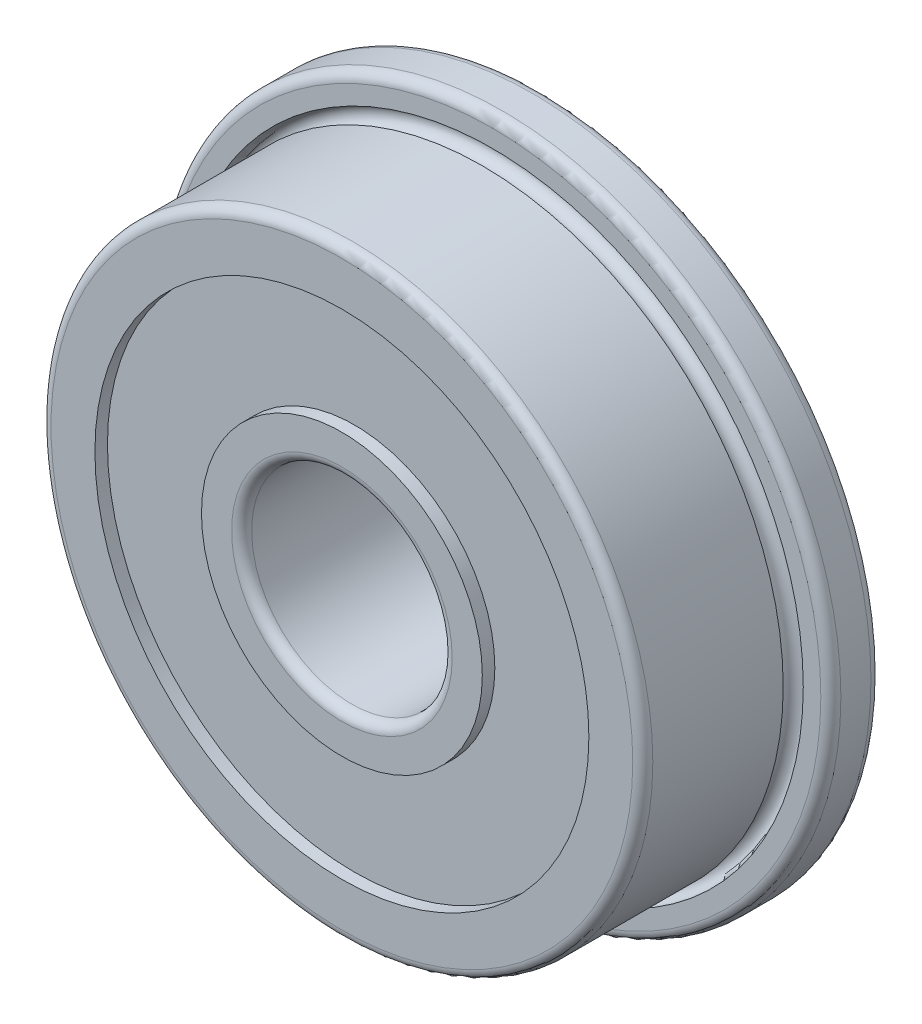
ISO-10303-21;
HEADER;
FILE_DESCRIPTION(('STEP AP214'),'2;1');
FILE_NAME('part.step','',(''),(''),'','','');
FILE_SCHEMA(('AUTOMOTIVE_DESIGN { 1 0 10303 214 1 1 1 1 }'));
ENDSEC;
DATA;
#1=APPLICATION_CONTEXT('core data for automotive mechanical design processes');
#2=APPLICATION_PROTOCOL_DEFINITION('international standard','automotive_design',2000,#1);
#3=PRODUCT_CONTEXT('',#1,'mechanical');
#4=PRODUCT('Part','Part','',(#3));
#5=PRODUCT_RELATED_PRODUCT_CATEGORY('part','',(#4));
#6=PRODUCT_DEFINITION_FORMATION('','',#4);
#7=PRODUCT_DEFINITION_CONTEXT('part definition',#1,'design');
#8=PRODUCT_DEFINITION('design','',#6,#7);
#9=PRODUCT_DEFINITION_SHAPE('','',#8);
#10=(LENGTH_UNIT() NAMED_UNIT(*) SI_UNIT(.MILLI.,.METRE.));
#11=(NAMED_UNIT(*) PLANE_ANGLE_UNIT() SI_UNIT($,.RADIAN.));
#12=(NAMED_UNIT(*) SI_UNIT($,.STERADIAN.) SOLID_ANGLE_UNIT());
#13=UNCERTAINTY_MEASURE_WITH_UNIT(LENGTH_MEASURE(1.E-05),#10,'distance_accuracy_value','');
#14=(GEOMETRIC_REPRESENTATION_CONTEXT(3) GLOBAL_UNCERTAINTY_ASSIGNED_CONTEXT((#13)) GLOBAL_UNIT_ASSIGNED_CONTEXT((#10,
#11,#12)) REPRESENTATION_CONTEXT('',''));
#15=CARTESIAN_POINT('',(0.,0.,0.));
#16=DIRECTION('',(0.,0.,1.));
#17=DIRECTION('',(1.,0.,0.));
#18=AXIS2_PLACEMENT_3D('',#15,#16,#17);
#19=CARTESIAN_POINT('',(0.,0.,-0.200000000000018));
#20=DIRECTION('',(0.,0.,1.));
#21=DIRECTION('',(1.,0.,0.));
#22=AXIS2_PLACEMENT_3D('',#19,#20,#21);
#23=TOROIDAL_SURFACE('',#22,5.79999999999998,0.200000000000018);
#24=CARTESIAN_POINT('',(0.,0.,0.));
#25=DIRECTION('',(0.,0.,1.));
#26=DIRECTION('',(1.,0.,0.));
#27=AXIS2_PLACEMENT_3D('',#24,#25,#26);
#28=CIRCLE('',#27,5.8);
#29=CARTESIAN_POINT('',(5.8,0.,0.));
#30=VERTEX_POINT('',#29);
#31=EDGE_CURVE('E10',#30,#30,#28,.T.);
#32=ORIENTED_EDGE('',*,*,#31,.F.);
#33=EDGE_LOOP('',(#32));
#34=FACE_BOUND('',#33,.T.);
#35=CARTESIAN_POINT('',(0.,0.,-0.2));
#36=DIRECTION('',(0.,0.,1.));
#37=DIRECTION('',(1.,0.,0.));
#38=AXIS2_PLACEMENT_3D('',#35,#36,#37);
#39=CIRCLE('',#38,6.);
#40=CARTESIAN_POINT('',(6.,0.,-0.2));
#41=VERTEX_POINT('',#40);
#42=EDGE_CURVE('E99',#41,#41,#39,.T.);
#43=ORIENTED_EDGE('',*,*,#42,.T.);
#44=EDGE_LOOP('',(#43));
#45=FACE_BOUND('',#44,.T.);
#46=ADVANCED_FACE('F35',(#34,#45),#23,.T.);
#47=CARTESIAN_POINT('',(0.,5.8,0.));
#48=DIRECTION('',(0.,0.,-1.));
#49=DIRECTION('',(-1.,0.,0.));
#50=AXIS2_PLACEMENT_3D('',#47,#48,#49);
#51=PLANE('',#50);
#52=CARTESIAN_POINT('',(0.,0.,0.));
#53=DIRECTION('',(0.,0.,1.));
#54=DIRECTION('',(1.,0.,0.));
#55=AXIS2_PLACEMENT_3D('',#52,#53,#54);
#56=CIRCLE('',#55,4.925);
#57=CARTESIAN_POINT('',(4.925,0.,0.));
#58=VERTEX_POINT('',#57);
#59=EDGE_CURVE('E41',#58,#58,#56,.T.);
#60=ORIENTED_EDGE('',*,*,#59,.F.);
#61=EDGE_LOOP('',(#60));
#62=FACE_BOUND('',#61,.T.);
#63=ORIENTED_EDGE('',*,*,#31,.T.);
#64=EDGE_LOOP('',(#63));
#65=FACE_BOUND('',#64,.T.);
#66=ADVANCED_FACE('F208',(#62,#65),#51,.F.);
#67=CARTESIAN_POINT('',(0.,0.,-4.));
#68=DIRECTION('',(0.,0.,1.));
#69=DIRECTION('',(1.,0.,0.));
#70=AXIS2_PLACEMENT_3D('',#67,#68,#69);
#71=CYLINDRICAL_SURFACE('',#70,4.925);
#72=CARTESIAN_POINT('',(0.,0.,-0.25));
#73=DIRECTION('',(0.,0.,1.));
#74=DIRECTION('',(1.,0.,0.));
#75=AXIS2_PLACEMENT_3D('',#72,#73,#74);
#76=CIRCLE('',#75,4.925);
#77=CARTESIAN_POINT('',(4.925,0.,-0.25));
#78=VERTEX_POINT('',#77);
#79=EDGE_CURVE('E45',#78,#78,#76,.T.);
#80=ORIENTED_EDGE('',*,*,#79,.F.);
#81=EDGE_LOOP('',(#80));
#82=FACE_BOUND('',#81,.T.);
#83=ORIENTED_EDGE('',*,*,#59,.T.);
#84=EDGE_LOOP('',(#83));
#85=FACE_BOUND('',#84,.T.);
#86=ADVANCED_FACE('F203',(#82,#85),#71,.F.);
#87=CARTESIAN_POINT('',(0.,4.925,-0.25));
#88=DIRECTION('',(0.,0.,-1.));
#89=DIRECTION('',(-1.,0.,0.));
#90=AXIS2_PLACEMENT_3D('',#87,#88,#89);
#91=PLANE('',#90);
#92=CARTESIAN_POINT('',(0.,0.,-0.25));
#93=DIRECTION('',(0.,0.,1.));
#94=DIRECTION('',(1.,0.,0.));
#95=AXIS2_PLACEMENT_3D('',#92,#93,#94);
#96=CIRCLE('',#95,2.8);
#97=CARTESIAN_POINT('',(2.8,0.,-0.25));
#98=VERTEX_POINT('',#97);
#99=EDGE_CURVE('E49',#98,#98,#96,.T.);
#100=ORIENTED_EDGE('',*,*,#99,.F.);
#101=EDGE_LOOP('',(#100));
#102=FACE_BOUND('',#101,.T.);
#103=ORIENTED_EDGE('',*,*,#79,.T.);
#104=EDGE_LOOP('',(#103));
#105=FACE_BOUND('',#104,.T.);
#106=ADVANCED_FACE('F197',(#102,#105),#91,.F.);
#107=CARTESIAN_POINT('',(0.,0.,-4.));
#108=DIRECTION('',(0.,0.,1.));
#109=DIRECTION('',(1.,0.,0.));
#110=AXIS2_PLACEMENT_3D('',#107,#108,#109);
#111=CYLINDRICAL_SURFACE('',#110,2.8);
#112=CARTESIAN_POINT('',(0.,0.,0.));
#113=DIRECTION('',(0.,0.,1.));
#114=DIRECTION('',(1.,0.,0.));
#115=AXIS2_PLACEMENT_3D('',#112,#113,#114);
#116=CIRCLE('',#115,2.8);
#117=CARTESIAN_POINT('',(2.8,0.,0.));
#118=VERTEX_POINT('',#117);
#119=EDGE_CURVE('E54',#118,#118,#116,.T.);
#120=ORIENTED_EDGE('',*,*,#119,.F.);
#121=EDGE_LOOP('',(#120));
#122=FACE_BOUND('',#121,.T.);
#123=ORIENTED_EDGE('',*,*,#99,.T.);
#124=EDGE_LOOP('',(#123));
#125=FACE_BOUND('',#124,.T.);
#126=ADVANCED_FACE('F191',(#122,#125),#111,.T.);
#127=CARTESIAN_POINT('',(0.,2.8,0.));
#128=DIRECTION('',(0.,0.,-1.));
#129=DIRECTION('',(-1.,0.,0.));
#130=AXIS2_PLACEMENT_3D('',#127,#128,#129);
#131=PLANE('',#130);
#132=CARTESIAN_POINT('',(0.,0.,0.));
#133=DIRECTION('',(0.,0.,1.));
#134=DIRECTION('',(1.,0.,0.));
#135=AXIS2_PLACEMENT_3D('',#132,#133,#134);
#136=CIRCLE('',#135,2.2);
#137=CARTESIAN_POINT('',(2.2,0.,0.));
#138=VERTEX_POINT('',#137);
#139=EDGE_CURVE('E57',#138,#138,#136,.T.);
#140=ORIENTED_EDGE('',*,*,#139,.F.);
#141=EDGE_LOOP('',(#140));
#142=FACE_BOUND('',#141,.T.);
#143=ORIENTED_EDGE('',*,*,#119,.T.);
#144=EDGE_LOOP('',(#143));
#145=FACE_BOUND('',#144,.T.);
#146=ADVANCED_FACE('F185',(#142,#145),#131,.F.);
#147=CARTESIAN_POINT('',(0.,0.,-0.200000000000015));
#148=DIRECTION('',(0.,0.,1.));
#149=DIRECTION('',(1.,0.,0.));
#150=AXIS2_PLACEMENT_3D('',#147,#148,#149);
#151=TOROIDAL_SURFACE('',#150,2.20000000000002,0.200000000000015);
#152=CARTESIAN_POINT('',(0.,0.,-0.2));
#153=DIRECTION('',(0.,0.,1.));
#154=DIRECTION('',(1.,0.,0.));
#155=AXIS2_PLACEMENT_3D('',#152,#153,#154);
#156=CIRCLE('',#155,2.);
#157=CARTESIAN_POINT('',(2.,0.,-0.2));
#158=VERTEX_POINT('',#157);
#159=EDGE_CURVE('E60',#158,#158,#156,.T.);
#160=ORIENTED_EDGE('',*,*,#159,.F.);
#161=EDGE_LOOP('',(#160));
#162=FACE_BOUND('',#161,.T.);
#163=ORIENTED_EDGE('',*,*,#139,.T.);
#164=EDGE_LOOP('',(#163));
#165=FACE_BOUND('',#164,.T.);
#166=ADVANCED_FACE('F179',(#162,#165),#151,.T.);
#167=CARTESIAN_POINT('',(0.,0.,-4.));
#168=DIRECTION('',(0.,0.,1.));
#169=DIRECTION('',(1.,0.,0.));
#170=AXIS2_PLACEMENT_3D('',#167,#168,#169);
#171=CYLINDRICAL_SURFACE('',#170,2.);
#172=CARTESIAN_POINT('',(0.,0.,-3.8));
#173=DIRECTION('',(0.,0.,1.));
#174=DIRECTION('',(1.,0.,0.));
#175=AXIS2_PLACEMENT_3D('',#172,#173,#174);
#176=CIRCLE('',#175,2.);
#177=CARTESIAN_POINT('',(2.,0.,-3.8));
#178=VERTEX_POINT('',#177);
#179=EDGE_CURVE('E63',#178,#178,#176,.T.);
#180=ORIENTED_EDGE('',*,*,#179,.F.);
#181=EDGE_LOOP('',(#180));
#182=FACE_BOUND('',#181,.T.);
#183=ORIENTED_EDGE('',*,*,#159,.T.);
#184=EDGE_LOOP('',(#183));
#185=FACE_BOUND('',#184,.T.);
#186=ADVANCED_FACE('F173',(#182,#185),#171,.F.);
#187=CARTESIAN_POINT('',(0.,0.,-3.79999999999997));
#188=DIRECTION('',(0.,0.,1.));
#189=DIRECTION('',(1.,0.,0.));
#190=AXIS2_PLACEMENT_3D('',#187,#188,#189);
#191=TOROIDAL_SURFACE('',#190,2.20000000000003,0.200000000000033);
#192=CARTESIAN_POINT('',(0.,0.,-4.));
#193=DIRECTION('',(0.,0.,1.));
#194=DIRECTION('',(1.,0.,0.));
#195=AXIS2_PLACEMENT_3D('',#192,#193,#194);
#196=CIRCLE('',#195,2.2);
#197=CARTESIAN_POINT('',(2.2,0.,-4.));
#198=VERTEX_POINT('',#197);
#199=EDGE_CURVE('E66',#198,#198,#196,.T.);
#200=ORIENTED_EDGE('',*,*,#199,.F.);
#201=EDGE_LOOP('',(#200));
#202=FACE_BOUND('',#201,.T.);
#203=ORIENTED_EDGE('',*,*,#179,.T.);
#204=EDGE_LOOP('',(#203));
#205=FACE_BOUND('',#204,.T.);
#206=ADVANCED_FACE('F167',(#202,#205),#191,.T.);
#207=CARTESIAN_POINT('',(0.,2.2,-4.));
#208=DIRECTION('',(0.,0.,1.));
#209=DIRECTION('',(1.,0.,0.));
#210=AXIS2_PLACEMENT_3D('',#207,#208,#209);
#211=PLANE('',#210);
#212=CARTESIAN_POINT('',(0.,0.,-4.));
#213=DIRECTION('',(0.,0.,1.));
#214=DIRECTION('',(1.,0.,0.));
#215=AXIS2_PLACEMENT_3D('',#212,#213,#214);
#216=CIRCLE('',#215,2.8);
#217=CARTESIAN_POINT('',(2.8,0.,-4.));
#218=VERTEX_POINT('',#217);
#219=EDGE_CURVE('E69',#218,#218,#216,.T.);
#220=ORIENTED_EDGE('',*,*,#219,.F.);
#221=EDGE_LOOP('',(#220));
#222=FACE_BOUND('',#221,.T.);
#223=ORIENTED_EDGE('',*,*,#199,.T.);
#224=EDGE_LOOP('',(#223));
#225=FACE_BOUND('',#224,.T.);
#226=ADVANCED_FACE('F161',(#222,#225),#211,.F.);
#227=CARTESIAN_POINT('',(0.,0.,-4.));
#228=DIRECTION('',(0.,0.,1.));
#229=DIRECTION('',(1.,0.,0.));
#230=AXIS2_PLACEMENT_3D('',#227,#228,#229);
#231=CYLINDRICAL_SURFACE('',#230,2.8);
#232=CARTESIAN_POINT('',(0.,0.,-3.75));
#233=DIRECTION('',(0.,0.,1.));
#234=DIRECTION('',(1.,0.,0.));
#235=AXIS2_PLACEMENT_3D('',#232,#233,#234);
#236=CIRCLE('',#235,2.8);
#237=CARTESIAN_POINT('',(2.8,0.,-3.75));
#238=VERTEX_POINT('',#237);
#239=EDGE_CURVE('E72',#238,#238,#236,.T.);
#240=ORIENTED_EDGE('',*,*,#239,.F.);
#241=EDGE_LOOP('',(#240));
#242=FACE_BOUND('',#241,.T.);
#243=ORIENTED_EDGE('',*,*,#219,.T.);
#244=EDGE_LOOP('',(#243));
#245=FACE_BOUND('',#244,.T.);
#246=ADVANCED_FACE('F155',(#242,#245),#231,.T.);
#247=CARTESIAN_POINT('',(0.,2.8,-3.75));
#248=DIRECTION('',(0.,0.,1.));
#249=DIRECTION('',(1.,0.,0.));
#250=AXIS2_PLACEMENT_3D('',#247,#248,#249);
#251=PLANE('',#250);
#252=CARTESIAN_POINT('',(0.,0.,-3.75));
#253=DIRECTION('',(0.,0.,1.));
#254=DIRECTION('',(1.,0.,0.));
#255=AXIS2_PLACEMENT_3D('',#252,#253,#254);
#256=CIRCLE('',#255,4.925);
#257=CARTESIAN_POINT('',(4.925,0.,-3.75));
#258=VERTEX_POINT('',#257);
#259=EDGE_CURVE('E75',#258,#258,#256,.T.);
#260=ORIENTED_EDGE('',*,*,#259,.F.);
#261=EDGE_LOOP('',(#260));
#262=FACE_BOUND('',#261,.T.);
#263=ORIENTED_EDGE('',*,*,#239,.T.);
#264=EDGE_LOOP('',(#263));
#265=FACE_BOUND('',#264,.T.);
#266=ADVANCED_FACE('F149',(#262,#265),#251,.F.);
#267=CARTESIAN_POINT('',(0.,0.,-4.));
#268=DIRECTION('',(0.,0.,1.));
#269=DIRECTION('',(1.,0.,0.));
#270=AXIS2_PLACEMENT_3D('',#267,#268,#269);
#271=CYLINDRICAL_SURFACE('',#270,4.925);
#272=CARTESIAN_POINT('',(0.,0.,-4.));
#273=DIRECTION('',(0.,0.,1.));
#274=DIRECTION('',(1.,0.,0.));
#275=AXIS2_PLACEMENT_3D('',#272,#273,#274);
#276=CIRCLE('',#275,4.925);
#277=CARTESIAN_POINT('',(4.925,0.,-4.));
#278=VERTEX_POINT('',#277);
#279=EDGE_CURVE('E78',#278,#278,#276,.T.);
#280=ORIENTED_EDGE('',*,*,#279,.F.);
#281=EDGE_LOOP('',(#280));
#282=FACE_BOUND('',#281,.T.);
#283=ORIENTED_EDGE('',*,*,#259,.T.);
#284=EDGE_LOOP('',(#283));
#285=FACE_BOUND('',#284,.T.);
#286=ADVANCED_FACE('F143',(#282,#285),#271,.F.);
#287=CARTESIAN_POINT('',(0.,4.925,-4.));
#288=DIRECTION('',(0.,0.,1.));
#289=DIRECTION('',(1.,0.,0.));
#290=AXIS2_PLACEMENT_3D('',#287,#288,#289);
#291=PLANE('',#290);
#292=CARTESIAN_POINT('',(0.,0.,-4.));
#293=DIRECTION('',(0.,0.,1.));
#294=DIRECTION('',(1.,0.,0.));
#295=AXIS2_PLACEMENT_3D('',#292,#293,#294);
#296=CIRCLE('',#295,6.55);
#297=CARTESIAN_POINT('',(6.55,0.,-4.));
#298=VERTEX_POINT('',#297);
#299=EDGE_CURVE('E81',#298,#298,#296,.T.);
#300=ORIENTED_EDGE('',*,*,#299,.F.);
#301=EDGE_LOOP('',(#300));
#302=FACE_BOUND('',#301,.T.);
#303=ORIENTED_EDGE('',*,*,#279,.T.);
#304=EDGE_LOOP('',(#303));
#305=FACE_BOUND('',#304,.T.);
#306=ADVANCED_FACE('F137',(#302,#305),#291,.F.);
#307=CARTESIAN_POINT('',(0.,0.,-3.79999999999997));
#308=DIRECTION('',(0.,0.,1.));
#309=DIRECTION('',(1.,0.,0.));
#310=AXIS2_PLACEMENT_3D('',#307,#308,#309);
#311=TOROIDAL_SURFACE('',#310,6.54999999999997,0.200000000000032);
#312=CARTESIAN_POINT('',(0.,0.,-3.8));
#313=DIRECTION('',(0.,0.,1.));
#314=DIRECTION('',(1.,0.,0.));
#315=AXIS2_PLACEMENT_3D('',#312,#313,#314);
#316=CIRCLE('',#315,6.75);
#317=CARTESIAN_POINT('',(6.75,0.,-3.8));
#318=VERTEX_POINT('',#317);
#319=EDGE_CURVE('E84',#318,#318,#316,.T.);
#320=ORIENTED_EDGE('',*,*,#319,.F.);
#321=EDGE_LOOP('',(#320));
#322=FACE_BOUND('',#321,.T.);
#323=ORIENTED_EDGE('',*,*,#299,.T.);
#324=EDGE_LOOP('',(#323));
#325=FACE_BOUND('',#324,.T.);
#326=ADVANCED_FACE('F131',(#322,#325),#311,.T.);
#327=CARTESIAN_POINT('',(0.,0.,-4.));
#328=DIRECTION('',(0.,0.,1.));
#329=DIRECTION('',(1.,0.,0.));
#330=AXIS2_PLACEMENT_3D('',#327,#328,#329);
#331=CYLINDRICAL_SURFACE('',#330,6.75);
#332=CARTESIAN_POINT('',(0.,0.,-3.2));
#333=DIRECTION('',(0.,0.,1.));
#334=DIRECTION('',(1.,0.,0.));
#335=AXIS2_PLACEMENT_3D('',#332,#333,#334);
#336=CIRCLE('',#335,6.75);
#337=CARTESIAN_POINT('',(6.75,0.,-3.2));
#338=VERTEX_POINT('',#337);
#339=EDGE_CURVE('E87',#338,#338,#336,.T.);
#340=ORIENTED_EDGE('',*,*,#339,.F.);
#341=EDGE_LOOP('',(#340));
#342=FACE_BOUND('',#341,.T.);
#343=ORIENTED_EDGE('',*,*,#319,.T.);
#344=EDGE_LOOP('',(#343));
#345=FACE_BOUND('',#344,.T.);
#346=ADVANCED_FACE('F125',(#342,#345),#331,.T.);
#347=CARTESIAN_POINT('',(0.,0.,-3.20000000000003));
#348=DIRECTION('',(0.,0.,1.));
#349=DIRECTION('',(1.,0.,0.));
#350=AXIS2_PLACEMENT_3D('',#347,#348,#349);
#351=TOROIDAL_SURFACE('',#350,6.54999999999997,0.200000000000032);
#352=CARTESIAN_POINT('',(0.,0.,-3.));
#353=DIRECTION('',(0.,0.,1.));
#354=DIRECTION('',(1.,0.,0.));
#355=AXIS2_PLACEMENT_3D('',#352,#353,#354);
#356=CIRCLE('',#355,6.55);
#357=CARTESIAN_POINT('',(6.55,0.,-3.));
#358=VERTEX_POINT('',#357);
#359=EDGE_CURVE('E90',#358,#358,#356,.T.);
#360=ORIENTED_EDGE('',*,*,#359,.F.);
#361=EDGE_LOOP('',(#360));
#362=FACE_BOUND('',#361,.T.);
#363=ORIENTED_EDGE('',*,*,#339,.T.);
#364=EDGE_LOOP('',(#363));
#365=FACE_BOUND('',#364,.T.);
#366=ADVANCED_FACE('F119',(#362,#365),#351,.T.);
#367=CARTESIAN_POINT('',(0.,6.55,-3.));
#368=DIRECTION('',(0.,0.,-1.));
#369=DIRECTION('',(-1.,0.,0.));
#370=AXIS2_PLACEMENT_3D('',#367,#368,#369);
#371=PLANE('',#370);
#372=CARTESIAN_POINT('',(0.,0.,-3.));
#373=DIRECTION('',(0.,0.,1.));
#374=DIRECTION('',(1.,0.,0.));
#375=AXIS2_PLACEMENT_3D('',#372,#373,#374);
#376=CIRCLE('',#375,6.2);
#377=CARTESIAN_POINT('',(6.2,0.,-3.));
#378=VERTEX_POINT('',#377);
#379=EDGE_CURVE('E93',#378,#378,#376,.T.);
#380=ORIENTED_EDGE('',*,*,#379,.F.);
#381=EDGE_LOOP('',(#380));
#382=FACE_BOUND('',#381,.T.);
#383=ORIENTED_EDGE('',*,*,#359,.T.);
#384=EDGE_LOOP('',(#383));
#385=FACE_BOUND('',#384,.T.);
#386=ADVANCED_FACE('F113',(#382,#385),#371,.F.);
#387=CARTESIAN_POINT('',(0.,0.,-2.99999999999999));
#388=DIRECTION('',(0.,0.,1.));
#389=DIRECTION('',(1.,0.,0.));
#390=AXIS2_PLACEMENT_3D('',#387,#388,#389);
#391=TOROIDAL_SURFACE('',#390,6.00000000000001,0.199999999999994);
#392=CARTESIAN_POINT('',(0.,0.,-2.8));
#393=DIRECTION('',(0.,0.,1.));
#394=DIRECTION('',(1.,0.,0.));
#395=AXIS2_PLACEMENT_3D('',#392,#393,#394);
#396=CIRCLE('',#395,6.);
#397=CARTESIAN_POINT('',(6.,0.,-2.8));
#398=VERTEX_POINT('',#397);
#399=EDGE_CURVE('E96',#398,#398,#396,.T.);
#400=ORIENTED_EDGE('',*,*,#399,.F.);
#401=EDGE_LOOP('',(#400));
#402=FACE_BOUND('',#401,.T.);
#403=ORIENTED_EDGE('',*,*,#379,.T.);
#404=EDGE_LOOP('',(#403));
#405=FACE_BOUND('',#404,.T.);
#406=ADVANCED_FACE('F107',(#402,#405),#391,.F.);
#407=CARTESIAN_POINT('',(0.,0.,-4.));
#408=DIRECTION('',(0.,0.,1.));
#409=DIRECTION('',(1.,0.,0.));
#410=AXIS2_PLACEMENT_3D('',#407,#408,#409);
#411=CYLINDRICAL_SURFACE('',#410,6.);
#412=ORIENTED_EDGE('',*,*,#42,.F.);
#413=EDGE_LOOP('',(#412));
#414=FACE_BOUND('',#413,.T.);
#415=ORIENTED_EDGE('',*,*,#399,.T.);
#416=EDGE_LOOP('',(#415));
#417=FACE_BOUND('',#416,.T.);
#418=ADVANCED_FACE('F104',(#414,#417),#411,.T.);
#419=CLOSED_SHELL('',(#46,#66,#86,#106,#126,#146,#166,#186,#206,#226,#246,#266,#286,#306,#326,
#346,#366,#386,#406,#418));
#420=MANIFOLD_SOLID_BREP('B2',#419);
#421=ADVANCED_BREP_SHAPE_REPRESENTATION('',(#18,#420),#14);
#422=SHAPE_DEFINITION_REPRESENTATION(#9,#421);
ENDSEC;
END-ISO-10303-21;
